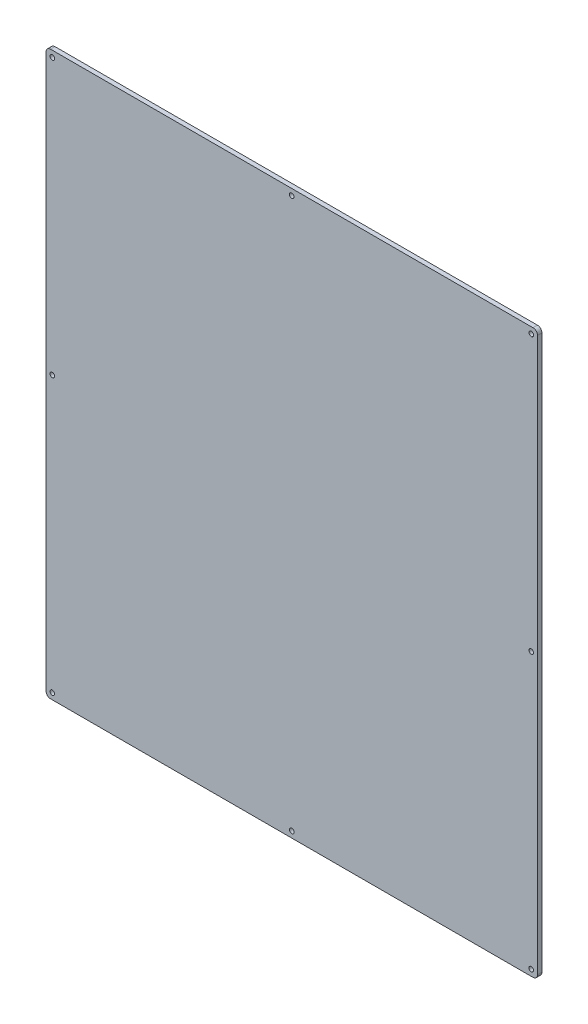
ISO-10303-21;
HEADER;
FILE_DESCRIPTION(('STEP AP214'),'2;1');
FILE_NAME('part.step','',(''),(''),'','','');
FILE_SCHEMA(('AUTOMOTIVE_DESIGN { 1 0 10303 214 1 1 1 1 }'));
ENDSEC;
DATA;
#1=APPLICATION_CONTEXT('core data for automotive mechanical design processes');
#2=APPLICATION_PROTOCOL_DEFINITION('international standard','automotive_design',2000,#1);
#3=PRODUCT_CONTEXT('',#1,'mechanical');
#4=PRODUCT('Part','Part','',(#3));
#5=PRODUCT_RELATED_PRODUCT_CATEGORY('part','',(#4));
#6=PRODUCT_DEFINITION_FORMATION('','',#4);
#7=PRODUCT_DEFINITION_CONTEXT('part definition',#1,'design');
#8=PRODUCT_DEFINITION('design','',#6,#7);
#9=PRODUCT_DEFINITION_SHAPE('','',#8);
#10=(LENGTH_UNIT() NAMED_UNIT(*) SI_UNIT(.MILLI.,.METRE.));
#11=(NAMED_UNIT(*) PLANE_ANGLE_UNIT() SI_UNIT($,.RADIAN.));
#12=(NAMED_UNIT(*) SI_UNIT($,.STERADIAN.) SOLID_ANGLE_UNIT());
#13=UNCERTAINTY_MEASURE_WITH_UNIT(LENGTH_MEASURE(1.E-05),#10,'distance_accuracy_value','');
#14=(GEOMETRIC_REPRESENTATION_CONTEXT(3) GLOBAL_UNCERTAINTY_ASSIGNED_CONTEXT((#13)) GLOBAL_UNIT_ASSIGNED_CONTEXT((#10,
#11,#12)) REPRESENTATION_CONTEXT('',''));
#15=CARTESIAN_POINT('',(0.,0.,0.));
#16=DIRECTION('',(0.,0.,1.));
#17=DIRECTION('',(1.,0.,0.));
#18=AXIS2_PLACEMENT_3D('',#15,#16,#17);
#19=CARTESIAN_POINT('',(0.,0.,-2.5));
#20=DIRECTION('',(0.,0.,1.));
#21=DIRECTION('',(1.,0.,0.));
#22=AXIS2_PLACEMENT_3D('',#19,#20,#21);
#23=PLANE('',#22);
#24=CARTESIAN_POINT('',(-269.,0.,-2.5));
#25=DIRECTION('',(0.,0.,1.));
#26=DIRECTION('',(1.,0.,0.));
#27=AXIS2_PLACEMENT_3D('',#24,#25,#26);
#28=CIRCLE('',#27,2.59999999999999);
#29=CARTESIAN_POINT('',(-266.4,0.,-2.5));
#30=VERTEX_POINT('',#29);
#31=EDGE_CURVE('E189',#30,#30,#28,.T.);
#32=ORIENTED_EDGE('',*,*,#31,.T.);
#33=EDGE_LOOP('',(#32));
#34=FACE_BOUND('',#33,.T.);
#35=CARTESIAN_POINT('',(-269.,-309.,-2.5));
#36=DIRECTION('',(0.,0.,1.));
#37=DIRECTION('',(1.,0.,0.));
#38=AXIS2_PLACEMENT_3D('',#35,#36,#37);
#39=CIRCLE('',#38,2.59999999999999);
#40=CARTESIAN_POINT('',(-266.4,-309.,-2.5));
#41=VERTEX_POINT('',#40);
#42=EDGE_CURVE('E192',#41,#41,#39,.T.);
#43=ORIENTED_EDGE('',*,*,#42,.T.);
#44=EDGE_LOOP('',(#43));
#45=FACE_BOUND('',#44,.T.);
#46=CARTESIAN_POINT('',(0.,-309.,-2.5));
#47=DIRECTION('',(0.,0.,1.));
#48=DIRECTION('',(1.,0.,0.));
#49=AXIS2_PLACEMENT_3D('',#46,#47,#48);
#50=CIRCLE('',#49,2.59999999999999);
#51=CARTESIAN_POINT('',(2.6,-309.,-2.5));
#52=VERTEX_POINT('',#51);
#53=EDGE_CURVE('E195',#52,#52,#50,.T.);
#54=ORIENTED_EDGE('',*,*,#53,.T.);
#55=EDGE_LOOP('',(#54));
#56=FACE_BOUND('',#55,.T.);
#57=CARTESIAN_POINT('',(269.,-309.,-2.5));
#58=DIRECTION('',(0.,0.,1.));
#59=DIRECTION('',(1.,0.,0.));
#60=AXIS2_PLACEMENT_3D('',#57,#58,#59);
#61=CIRCLE('',#60,2.59999999999999);
#62=CARTESIAN_POINT('',(271.6,-309.,-2.5));
#63=VERTEX_POINT('',#62);
#64=EDGE_CURVE('E198',#63,#63,#61,.T.);
#65=ORIENTED_EDGE('',*,*,#64,.T.);
#66=EDGE_LOOP('',(#65));
#67=FACE_BOUND('',#66,.T.);
#68=CARTESIAN_POINT('',(269.,0.,-2.5));
#69=DIRECTION('',(0.,0.,1.));
#70=DIRECTION('',(1.,0.,0.));
#71=AXIS2_PLACEMENT_3D('',#68,#69,#70);
#72=CIRCLE('',#71,2.59999999999999);
#73=CARTESIAN_POINT('',(271.6,0.,-2.5));
#74=VERTEX_POINT('',#73);
#75=EDGE_CURVE('E201',#74,#74,#72,.T.);
#76=ORIENTED_EDGE('',*,*,#75,.T.);
#77=EDGE_LOOP('',(#76));
#78=FACE_BOUND('',#77,.T.);
#79=CARTESIAN_POINT('',(269.,309.,-2.5));
#80=DIRECTION('',(0.,0.,1.));
#81=DIRECTION('',(1.,0.,0.));
#82=AXIS2_PLACEMENT_3D('',#79,#80,#81);
#83=CIRCLE('',#82,2.59999999999999);
#84=CARTESIAN_POINT('',(271.6,309.,-2.5));
#85=VERTEX_POINT('',#84);
#86=EDGE_CURVE('E204',#85,#85,#83,.T.);
#87=ORIENTED_EDGE('',*,*,#86,.T.);
#88=EDGE_LOOP('',(#87));
#89=FACE_BOUND('',#88,.T.);
#90=CARTESIAN_POINT('',(0.,309.,-2.5));
#91=DIRECTION('',(0.,0.,1.));
#92=DIRECTION('',(1.,0.,0.));
#93=AXIS2_PLACEMENT_3D('',#90,#91,#92);
#94=CIRCLE('',#93,2.59999999999999);
#95=CARTESIAN_POINT('',(2.6,309.,-2.5));
#96=VERTEX_POINT('',#95);
#97=EDGE_CURVE('E207',#96,#96,#94,.T.);
#98=ORIENTED_EDGE('',*,*,#97,.T.);
#99=EDGE_LOOP('',(#98));
#100=FACE_BOUND('',#99,.T.);
#101=CARTESIAN_POINT('',(-269.,309.,-2.5));
#102=DIRECTION('',(0.,0.,1.));
#103=DIRECTION('',(1.,0.,0.));
#104=AXIS2_PLACEMENT_3D('',#101,#102,#103);
#105=CIRCLE('',#104,2.59999999999999);
#106=CARTESIAN_POINT('',(-266.4,309.,-2.5));
#107=VERTEX_POINT('',#106);
#108=EDGE_CURVE('E210',#107,#107,#105,.T.);
#109=ORIENTED_EDGE('',*,*,#108,.T.);
#110=EDGE_LOOP('',(#109));
#111=FACE_BOUND('',#110,.T.);
#112=DIRECTION('',(1.,0.,0.));
#113=VECTOR('',#112,1.);
#114=CARTESIAN_POINT('',(-276.,316.,-2.5));
#115=LINE('',#114,#113);
#116=CARTESIAN_POINT('',(-271.,316.,-2.5));
#117=VERTEX_POINT('',#116);
#118=CARTESIAN_POINT('',(271.,316.,-2.5));
#119=VERTEX_POINT('',#118);
#120=EDGE_CURVE('E152',#117,#119,#115,.T.);
#121=ORIENTED_EDGE('',*,*,#120,.T.);
#122=CARTESIAN_POINT('',(271.,311.,-2.5));
#123=DIRECTION('',(0.,0.,-1.));
#124=DIRECTION('',(-1.,0.,0.));
#125=AXIS2_PLACEMENT_3D('',#122,#123,#124);
#126=CIRCLE('',#125,5.);
#127=CARTESIAN_POINT('',(276.,311.,-2.5));
#128=VERTEX_POINT('',#127);
#129=EDGE_CURVE('E124',#128,#119,#126,.F.);
#130=ORIENTED_EDGE('',*,*,#129,.F.);
#131=DIRECTION('',(0.,-1.,0.));
#132=VECTOR('',#131,1.);
#133=CARTESIAN_POINT('',(276.,316.,-2.5));
#134=LINE('',#133,#132);
#135=CARTESIAN_POINT('',(276.,-311.,-2.5));
#136=VERTEX_POINT('',#135);
#137=EDGE_CURVE('E122',#128,#136,#134,.T.);
#138=ORIENTED_EDGE('',*,*,#137,.T.);
#139=CARTESIAN_POINT('',(271.,-311.,-2.5));
#140=DIRECTION('',(0.,0.,-1.));
#141=DIRECTION('',(-1.,0.,0.));
#142=AXIS2_PLACEMENT_3D('',#139,#140,#141);
#143=CIRCLE('',#142,5.);
#144=CARTESIAN_POINT('',(271.,-316.,-2.5));
#145=VERTEX_POINT('',#144);
#146=EDGE_CURVE('E47',#145,#136,#143,.F.);
#147=ORIENTED_EDGE('',*,*,#146,.F.);
#148=DIRECTION('',(1.,0.,0.));
#149=VECTOR('',#148,1.);
#150=CARTESIAN_POINT('',(-276.,-316.,-2.5));
#151=LINE('',#150,#149);
#152=CARTESIAN_POINT('',(-271.,-316.,-2.5));
#153=VERTEX_POINT('',#152);
#154=EDGE_CURVE('E136',#145,#153,#151,.F.);
#155=ORIENTED_EDGE('',*,*,#154,.T.);
#156=CARTESIAN_POINT('',(-271.,-311.,-2.5));
#157=DIRECTION('',(0.,0.,-1.));
#158=DIRECTION('',(-1.,0.,0.));
#159=AXIS2_PLACEMENT_3D('',#156,#157,#158);
#160=CIRCLE('',#159,5.);
#161=CARTESIAN_POINT('',(-276.,-311.,-2.5));
#162=VERTEX_POINT('',#161);
#163=EDGE_CURVE('E213',#162,#153,#160,.F.);
#164=ORIENTED_EDGE('',*,*,#163,.F.);
#165=DIRECTION('',(0.,1.,0.));
#166=VECTOR('',#165,1.);
#167=CARTESIAN_POINT('',(-276.,316.,-2.5));
#168=LINE('',#167,#166);
#169=CARTESIAN_POINT('',(-276.,311.,-2.5));
#170=VERTEX_POINT('',#169);
#171=EDGE_CURVE('E147',#162,#170,#168,.T.);
#172=ORIENTED_EDGE('',*,*,#171,.T.);
#173=CARTESIAN_POINT('',(-271.,311.,-2.5));
#174=DIRECTION('',(0.,0.,-1.));
#175=DIRECTION('',(-1.,0.,0.));
#176=AXIS2_PLACEMENT_3D('',#173,#174,#175);
#177=CIRCLE('',#176,5.);
#178=EDGE_CURVE('E217',#117,#170,#177,.F.);
#179=ORIENTED_EDGE('',*,*,#178,.F.);
#180=EDGE_LOOP('',(#121,#130,#138,#147,#155,#164,#172,#179));
#181=FACE_BOUND('',#180,.T.);
#182=ADVANCED_FACE('F44',(#34,#45,#56,#67,#78,#89,#100,#111,#181),#23,.F.);
#183=CARTESIAN_POINT('',(-276.,-316.,2.5));
#184=DIRECTION('',(0.,1.,0.));
#185=DIRECTION('',(0.,0.,1.));
#186=AXIS2_PLACEMENT_3D('',#183,#184,#185);
#187=PLANE('',#186);
#188=DIRECTION('',(1.,0.,0.));
#189=VECTOR('',#188,1.);
#190=CARTESIAN_POINT('',(0.,-316.,2.5));
#191=LINE('',#190,#189);
#192=CARTESIAN_POINT('',(-271.,-316.,2.5));
#193=VERTEX_POINT('',#192);
#194=CARTESIAN_POINT('',(271.,-316.,2.5));
#195=VERTEX_POINT('',#194);
#196=EDGE_CURVE('E188',#193,#195,#191,.T.);
#197=ORIENTED_EDGE('',*,*,#196,.F.);
#198=DIRECTION('',(0.,0.,-1.));
#199=VECTOR('',#198,1.);
#200=CARTESIAN_POINT('',(-271.,-316.,2.5));
#201=LINE('',#200,#199);
#202=EDGE_CURVE('E216',#153,#193,#201,.F.);
#203=ORIENTED_EDGE('',*,*,#202,.F.);
#204=ORIENTED_EDGE('',*,*,#154,.F.);
#205=DIRECTION('',(0.,0.,-1.));
#206=VECTOR('',#205,1.);
#207=CARTESIAN_POINT('',(271.,-316.,2.5));
#208=LINE('',#207,#206);
#209=EDGE_CURVE('E129',#195,#145,#208,.T.);
#210=ORIENTED_EDGE('',*,*,#209,.F.);
#211=EDGE_LOOP('',(#197,#203,#204,#210));
#212=FACE_BOUND('',#211,.T.);
#213=ADVANCED_FACE('F249',(#212),#187,.F.);
#214=CARTESIAN_POINT('',(271.,-311.,2.5));
#215=DIRECTION('',(0.,0.,-1.));
#216=DIRECTION('',(-1.,0.,0.));
#217=AXIS2_PLACEMENT_3D('',#214,#215,#216);
#218=CYLINDRICAL_SURFACE('',#217,5.);
#219=CARTESIAN_POINT('',(271.,-311.,2.5));
#220=DIRECTION('',(0.,0.,-1.));
#221=DIRECTION('',(-1.,0.,0.));
#222=AXIS2_PLACEMENT_3D('',#219,#220,#221);
#223=CIRCLE('',#222,5.);
#224=CARTESIAN_POINT('',(276.,-311.,2.5));
#225=VERTEX_POINT('',#224);
#226=EDGE_CURVE('E186',#195,#225,#223,.F.);
#227=ORIENTED_EDGE('',*,*,#226,.F.);
#228=ORIENTED_EDGE('',*,*,#209,.T.);
#229=ORIENTED_EDGE('',*,*,#146,.T.);
#230=DIRECTION('',(0.,0.,1.));
#231=VECTOR('',#230,1.);
#232=CARTESIAN_POINT('',(276.,-311.,2.5));
#233=LINE('',#232,#231);
#234=EDGE_CURVE('E128',#136,#225,#233,.T.);
#235=ORIENTED_EDGE('',*,*,#234,.T.);
#236=EDGE_LOOP('',(#227,#228,#229,#235));
#237=FACE_BOUND('',#236,.T.);
#238=ADVANCED_FACE('F134',(#237),#218,.T.);
#239=CARTESIAN_POINT('',(276.,316.,2.5));
#240=DIRECTION('',(-1.,0.,0.));
#241=DIRECTION('',(0.,-1.,0.));
#242=AXIS2_PLACEMENT_3D('',#239,#240,#241);
#243=PLANE('',#242);
#244=DIRECTION('',(0.,1.,0.));
#245=VECTOR('',#244,1.);
#246=CARTESIAN_POINT('',(276.,0.,2.5));
#247=LINE('',#246,#245);
#248=CARTESIAN_POINT('',(276.,311.,2.5));
#249=VERTEX_POINT('',#248);
#250=EDGE_CURVE('E139',#225,#249,#247,.T.);
#251=ORIENTED_EDGE('',*,*,#250,.F.);
#252=ORIENTED_EDGE('',*,*,#234,.F.);
#253=ORIENTED_EDGE('',*,*,#137,.F.);
#254=DIRECTION('',(0.,0.,-1.));
#255=VECTOR('',#254,1.);
#256=CARTESIAN_POINT('',(276.,311.,2.5));
#257=LINE('',#256,#255);
#258=EDGE_CURVE('E142',#249,#128,#257,.T.);
#259=ORIENTED_EDGE('',*,*,#258,.F.);
#260=EDGE_LOOP('',(#251,#252,#253,#259));
#261=FACE_BOUND('',#260,.T.);
#262=ADVANCED_FACE('F137',(#261),#243,.F.);
#263=CARTESIAN_POINT('',(271.,311.,2.5));
#264=DIRECTION('',(0.,0.,-1.));
#265=DIRECTION('',(-1.,0.,0.));
#266=AXIS2_PLACEMENT_3D('',#263,#264,#265);
#267=CYLINDRICAL_SURFACE('',#266,5.);
#268=CARTESIAN_POINT('',(271.,311.,2.5));
#269=DIRECTION('',(0.,0.,-1.));
#270=DIRECTION('',(-1.,0.,0.));
#271=AXIS2_PLACEMENT_3D('',#268,#269,#270);
#272=CIRCLE('',#271,5.);
#273=CARTESIAN_POINT('',(271.,316.,2.5));
#274=VERTEX_POINT('',#273);
#275=EDGE_CURVE('E183',#249,#274,#272,.F.);
#276=ORIENTED_EDGE('',*,*,#275,.F.);
#277=ORIENTED_EDGE('',*,*,#258,.T.);
#278=ORIENTED_EDGE('',*,*,#129,.T.);
#279=DIRECTION('',(0.,0.,-1.));
#280=VECTOR('',#279,1.);
#281=CARTESIAN_POINT('',(271.,316.,2.5));
#282=LINE('',#281,#280);
#283=EDGE_CURVE('E153',#119,#274,#282,.F.);
#284=ORIENTED_EDGE('',*,*,#283,.T.);
#285=EDGE_LOOP('',(#276,#277,#278,#284));
#286=FACE_BOUND('',#285,.T.);
#287=ADVANCED_FACE('F246',(#286),#267,.T.);
#288=CARTESIAN_POINT('',(-276.,316.,2.5));
#289=DIRECTION('',(0.,-1.,0.));
#290=DIRECTION('',(0.,0.,-1.));
#291=AXIS2_PLACEMENT_3D('',#288,#289,#290);
#292=PLANE('',#291);
#293=DIRECTION('',(1.,0.,0.));
#294=VECTOR('',#293,1.);
#295=CARTESIAN_POINT('',(0.,316.,2.5));
#296=LINE('',#295,#294);
#297=CARTESIAN_POINT('',(-271.,316.,2.5));
#298=VERTEX_POINT('',#297);
#299=EDGE_CURVE('E182',#274,#298,#296,.F.);
#300=ORIENTED_EDGE('',*,*,#299,.F.);
#301=ORIENTED_EDGE('',*,*,#283,.F.);
#302=ORIENTED_EDGE('',*,*,#120,.F.);
#303=DIRECTION('',(0.,0.,-1.));
#304=VECTOR('',#303,1.);
#305=CARTESIAN_POINT('',(-271.,316.,2.5));
#306=LINE('',#305,#304);
#307=EDGE_CURVE('E150',#298,#117,#306,.T.);
#308=ORIENTED_EDGE('',*,*,#307,.F.);
#309=EDGE_LOOP('',(#300,#301,#302,#308));
#310=FACE_BOUND('',#309,.T.);
#311=ADVANCED_FACE('F244',(#310),#292,.F.);
#312=CARTESIAN_POINT('',(-271.,311.,2.5));
#313=DIRECTION('',(0.,0.,-1.));
#314=DIRECTION('',(-1.,0.,0.));
#315=AXIS2_PLACEMENT_3D('',#312,#313,#314);
#316=CYLINDRICAL_SURFACE('',#315,5.);
#317=CARTESIAN_POINT('',(-271.,311.,2.5));
#318=DIRECTION('',(0.,0.,-1.));
#319=DIRECTION('',(-1.,0.,0.));
#320=AXIS2_PLACEMENT_3D('',#317,#318,#319);
#321=CIRCLE('',#320,5.);
#322=CARTESIAN_POINT('',(-276.,311.,2.5));
#323=VERTEX_POINT('',#322);
#324=EDGE_CURVE('E179',#298,#323,#321,.F.);
#325=ORIENTED_EDGE('',*,*,#324,.F.);
#326=ORIENTED_EDGE('',*,*,#307,.T.);
#327=ORIENTED_EDGE('',*,*,#178,.T.);
#328=DIRECTION('',(0.,0.,1.));
#329=VECTOR('',#328,1.);
#330=CARTESIAN_POINT('',(-276.,311.,2.5));
#331=LINE('',#330,#329);
#332=EDGE_CURVE('E149',#170,#323,#331,.T.);
#333=ORIENTED_EDGE('',*,*,#332,.T.);
#334=EDGE_LOOP('',(#325,#326,#327,#333));
#335=FACE_BOUND('',#334,.T.);
#336=ADVANCED_FACE('F242',(#335),#316,.T.);
#337=CARTESIAN_POINT('',(-276.,316.,2.5));
#338=DIRECTION('',(1.,0.,0.));
#339=DIRECTION('',(0.,1.,0.));
#340=AXIS2_PLACEMENT_3D('',#337,#338,#339);
#341=PLANE('',#340);
#342=ORIENTED_EDGE('',*,*,#171,.F.);
#343=DIRECTION('',(0.,0.,-1.));
#344=VECTOR('',#343,1.);
#345=CARTESIAN_POINT('',(-276.,-311.,2.5));
#346=LINE('',#345,#344);
#347=CARTESIAN_POINT('',(-276.,-311.,2.5));
#348=VERTEX_POINT('',#347);
#349=EDGE_CURVE('E65',#348,#162,#346,.T.);
#350=ORIENTED_EDGE('',*,*,#349,.F.);
#351=DIRECTION('',(0.,1.,0.));
#352=VECTOR('',#351,1.);
#353=CARTESIAN_POINT('',(-276.,0.,2.5));
#354=LINE('',#353,#352);
#355=EDGE_CURVE('E178',#323,#348,#354,.F.);
#356=ORIENTED_EDGE('',*,*,#355,.F.);
#357=ORIENTED_EDGE('',*,*,#332,.F.);
#358=EDGE_LOOP('',(#342,#350,#356,#357));
#359=FACE_BOUND('',#358,.T.);
#360=ADVANCED_FACE('F241',(#359),#341,.F.);
#361=CARTESIAN_POINT('',(-271.,-311.,2.5));
#362=DIRECTION('',(0.,0.,-1.));
#363=DIRECTION('',(-1.,0.,0.));
#364=AXIS2_PLACEMENT_3D('',#361,#362,#363);
#365=CYLINDRICAL_SURFACE('',#364,5.);
#366=CARTESIAN_POINT('',(-271.,-311.,2.5));
#367=DIRECTION('',(0.,0.,-1.));
#368=DIRECTION('',(-1.,0.,0.));
#369=AXIS2_PLACEMENT_3D('',#366,#367,#368);
#370=CIRCLE('',#369,5.);
#371=EDGE_CURVE('E175',#348,#193,#370,.F.);
#372=ORIENTED_EDGE('',*,*,#371,.F.);
#373=ORIENTED_EDGE('',*,*,#349,.T.);
#374=ORIENTED_EDGE('',*,*,#163,.T.);
#375=ORIENTED_EDGE('',*,*,#202,.T.);
#376=EDGE_LOOP('',(#372,#373,#374,#375));
#377=FACE_BOUND('',#376,.T.);
#378=ADVANCED_FACE('F251',(#377),#365,.T.);
#379=CARTESIAN_POINT('',(-269.,309.,-2.5));
#380=DIRECTION('',(0.,0.,1.));
#381=DIRECTION('',(1.,0.,0.));
#382=AXIS2_PLACEMENT_3D('',#379,#380,#381);
#383=CYLINDRICAL_SURFACE('',#382,2.59999999999999);
#384=ORIENTED_EDGE('',*,*,#108,.F.);
#385=EDGE_LOOP('',(#384));
#386=FACE_BOUND('',#385,.T.);
#387=CARTESIAN_POINT('',(-269.,309.,2.5));
#388=DIRECTION('',(0.,0.,1.));
#389=DIRECTION('',(1.,0.,0.));
#390=AXIS2_PLACEMENT_3D('',#387,#388,#389);
#391=CIRCLE('',#390,2.59999999999999);
#392=CARTESIAN_POINT('',(-266.4,309.,2.5));
#393=VERTEX_POINT('',#392);
#394=EDGE_CURVE('E172',#393,#393,#391,.F.);
#395=ORIENTED_EDGE('',*,*,#394,.F.);
#396=EDGE_LOOP('',(#395));
#397=FACE_BOUND('',#396,.T.);
#398=ADVANCED_FACE('F253',(#386,#397),#383,.F.);
#399=CARTESIAN_POINT('',(0.,309.,-2.5));
#400=DIRECTION('',(0.,0.,1.));
#401=DIRECTION('',(1.,0.,0.));
#402=AXIS2_PLACEMENT_3D('',#399,#400,#401);
#403=CYLINDRICAL_SURFACE('',#402,2.59999999999999);
#404=ORIENTED_EDGE('',*,*,#97,.F.);
#405=EDGE_LOOP('',(#404));
#406=FACE_BOUND('',#405,.T.);
#407=CARTESIAN_POINT('',(0.,309.,2.5));
#408=DIRECTION('',(0.,0.,1.));
#409=DIRECTION('',(1.,0.,0.));
#410=AXIS2_PLACEMENT_3D('',#407,#408,#409);
#411=CIRCLE('',#410,2.59999999999999);
#412=CARTESIAN_POINT('',(2.6,309.,2.5));
#413=VERTEX_POINT('',#412);
#414=EDGE_CURVE('E169',#413,#413,#411,.F.);
#415=ORIENTED_EDGE('',*,*,#414,.F.);
#416=EDGE_LOOP('',(#415));
#417=FACE_BOUND('',#416,.T.);
#418=ADVANCED_FACE('F259',(#406,#417),#403,.F.);
#419=CARTESIAN_POINT('',(269.,309.,-2.5));
#420=DIRECTION('',(0.,0.,1.));
#421=DIRECTION('',(1.,0.,0.));
#422=AXIS2_PLACEMENT_3D('',#419,#420,#421);
#423=CYLINDRICAL_SURFACE('',#422,2.59999999999999);
#424=ORIENTED_EDGE('',*,*,#86,.F.);
#425=EDGE_LOOP('',(#424));
#426=FACE_BOUND('',#425,.T.);
#427=CARTESIAN_POINT('',(269.,309.,2.5));
#428=DIRECTION('',(0.,0.,1.));
#429=DIRECTION('',(1.,0.,0.));
#430=AXIS2_PLACEMENT_3D('',#427,#428,#429);
#431=CIRCLE('',#430,2.59999999999999);
#432=CARTESIAN_POINT('',(271.6,309.,2.5));
#433=VERTEX_POINT('',#432);
#434=EDGE_CURVE('E166',#433,#433,#431,.F.);
#435=ORIENTED_EDGE('',*,*,#434,.F.);
#436=EDGE_LOOP('',(#435));
#437=FACE_BOUND('',#436,.T.);
#438=ADVANCED_FACE('F289',(#426,#437),#423,.F.);
#439=CARTESIAN_POINT('',(269.,0.,-2.5));
#440=DIRECTION('',(0.,0.,1.));
#441=DIRECTION('',(1.,0.,0.));
#442=AXIS2_PLACEMENT_3D('',#439,#440,#441);
#443=CYLINDRICAL_SURFACE('',#442,2.59999999999999);
#444=ORIENTED_EDGE('',*,*,#75,.F.);
#445=EDGE_LOOP('',(#444));
#446=FACE_BOUND('',#445,.T.);
#447=CARTESIAN_POINT('',(269.,0.,2.5));
#448=DIRECTION('',(0.,0.,1.));
#449=DIRECTION('',(1.,0.,0.));
#450=AXIS2_PLACEMENT_3D('',#447,#448,#449);
#451=CIRCLE('',#450,2.59999999999999);
#452=CARTESIAN_POINT('',(271.6,0.,2.5));
#453=VERTEX_POINT('',#452);
#454=EDGE_CURVE('E163',#453,#453,#451,.F.);
#455=ORIENTED_EDGE('',*,*,#454,.F.);
#456=EDGE_LOOP('',(#455));
#457=FACE_BOUND('',#456,.T.);
#458=ADVANCED_FACE('F285',(#446,#457),#443,.F.);
#459=CARTESIAN_POINT('',(269.,-309.,-2.5));
#460=DIRECTION('',(0.,0.,1.));
#461=DIRECTION('',(1.,0.,0.));
#462=AXIS2_PLACEMENT_3D('',#459,#460,#461);
#463=CYLINDRICAL_SURFACE('',#462,2.59999999999999);
#464=ORIENTED_EDGE('',*,*,#64,.F.);
#465=EDGE_LOOP('',(#464));
#466=FACE_BOUND('',#465,.T.);
#467=CARTESIAN_POINT('',(269.,-309.,2.5));
#468=DIRECTION('',(0.,0.,1.));
#469=DIRECTION('',(1.,0.,0.));
#470=AXIS2_PLACEMENT_3D('',#467,#468,#469);
#471=CIRCLE('',#470,2.59999999999999);
#472=CARTESIAN_POINT('',(271.6,-309.,2.5));
#473=VERTEX_POINT('',#472);
#474=EDGE_CURVE('E160',#473,#473,#471,.F.);
#475=ORIENTED_EDGE('',*,*,#474,.F.);
#476=EDGE_LOOP('',(#475));
#477=FACE_BOUND('',#476,.T.);
#478=ADVANCED_FACE('F281',(#466,#477),#463,.F.);
#479=CARTESIAN_POINT('',(0.,-309.,-2.5));
#480=DIRECTION('',(0.,0.,1.));
#481=DIRECTION('',(1.,0.,0.));
#482=AXIS2_PLACEMENT_3D('',#479,#480,#481);
#483=CYLINDRICAL_SURFACE('',#482,2.59999999999999);
#484=ORIENTED_EDGE('',*,*,#53,.F.);
#485=EDGE_LOOP('',(#484));
#486=FACE_BOUND('',#485,.T.);
#487=CARTESIAN_POINT('',(0.,-309.,2.5));
#488=DIRECTION('',(0.,0.,1.));
#489=DIRECTION('',(1.,0.,0.));
#490=AXIS2_PLACEMENT_3D('',#487,#488,#489);
#491=CIRCLE('',#490,2.59999999999999);
#492=CARTESIAN_POINT('',(2.6,-309.,2.5));
#493=VERTEX_POINT('',#492);
#494=EDGE_CURVE('E157',#493,#493,#491,.F.);
#495=ORIENTED_EDGE('',*,*,#494,.F.);
#496=EDGE_LOOP('',(#495));
#497=FACE_BOUND('',#496,.T.);
#498=ADVANCED_FACE('F277',(#486,#497),#483,.F.);
#499=CARTESIAN_POINT('',(-269.,-309.,-2.5));
#500=DIRECTION('',(0.,0.,1.));
#501=DIRECTION('',(1.,0.,0.));
#502=AXIS2_PLACEMENT_3D('',#499,#500,#501);
#503=CYLINDRICAL_SURFACE('',#502,2.59999999999999);
#504=ORIENTED_EDGE('',*,*,#42,.F.);
#505=EDGE_LOOP('',(#504));
#506=FACE_BOUND('',#505,.T.);
#507=CARTESIAN_POINT('',(-269.,-309.,2.5));
#508=DIRECTION('',(0.,0.,1.));
#509=DIRECTION('',(1.,0.,0.));
#510=AXIS2_PLACEMENT_3D('',#507,#508,#509);
#511=CIRCLE('',#510,2.59999999999999);
#512=CARTESIAN_POINT('',(-266.4,-309.,2.5));
#513=VERTEX_POINT('',#512);
#514=EDGE_CURVE('E53',#513,#513,#511,.F.);
#515=ORIENTED_EDGE('',*,*,#514,.F.);
#516=EDGE_LOOP('',(#515));
#517=FACE_BOUND('',#516,.T.);
#518=ADVANCED_FACE('F270',(#506,#517),#503,.F.);
#519=CARTESIAN_POINT('',(-269.,0.,-2.5));
#520=DIRECTION('',(0.,0.,1.));
#521=DIRECTION('',(1.,0.,0.));
#522=AXIS2_PLACEMENT_3D('',#519,#520,#521);
#523=CYLINDRICAL_SURFACE('',#522,2.59999999999999);
#524=ORIENTED_EDGE('',*,*,#31,.F.);
#525=EDGE_LOOP('',(#524));
#526=FACE_BOUND('',#525,.T.);
#527=CARTESIAN_POINT('',(-269.,0.,2.5));
#528=DIRECTION('',(0.,0.,1.));
#529=DIRECTION('',(1.,0.,0.));
#530=AXIS2_PLACEMENT_3D('',#527,#528,#529);
#531=CIRCLE('',#530,2.59999999999999);
#532=CARTESIAN_POINT('',(-266.4,0.,2.5));
#533=VERTEX_POINT('',#532);
#534=EDGE_CURVE('E11',#533,#533,#531,.F.);
#535=ORIENTED_EDGE('',*,*,#534,.F.);
#536=EDGE_LOOP('',(#535));
#537=FACE_BOUND('',#536,.T.);
#538=ADVANCED_FACE('F264',(#526,#537),#523,.F.);
#539=CARTESIAN_POINT('',(0.,0.,2.5));
#540=DIRECTION('',(0.,0.,1.));
#541=DIRECTION('',(1.,0.,0.));
#542=AXIS2_PLACEMENT_3D('',#539,#540,#541);
#543=PLANE('',#542);
#544=ORIENTED_EDGE('',*,*,#534,.T.);
#545=EDGE_LOOP('',(#544));
#546=FACE_BOUND('',#545,.T.);
#547=ORIENTED_EDGE('',*,*,#514,.T.);
#548=EDGE_LOOP('',(#547));
#549=FACE_BOUND('',#548,.T.);
#550=ORIENTED_EDGE('',*,*,#494,.T.);
#551=EDGE_LOOP('',(#550));
#552=FACE_BOUND('',#551,.T.);
#553=ORIENTED_EDGE('',*,*,#474,.T.);
#554=EDGE_LOOP('',(#553));
#555=FACE_BOUND('',#554,.T.);
#556=ORIENTED_EDGE('',*,*,#454,.T.);
#557=EDGE_LOOP('',(#556));
#558=FACE_BOUND('',#557,.T.);
#559=ORIENTED_EDGE('',*,*,#434,.T.);
#560=EDGE_LOOP('',(#559));
#561=FACE_BOUND('',#560,.T.);
#562=ORIENTED_EDGE('',*,*,#414,.T.);
#563=EDGE_LOOP('',(#562));
#564=FACE_BOUND('',#563,.T.);
#565=ORIENTED_EDGE('',*,*,#394,.T.);
#566=EDGE_LOOP('',(#565));
#567=FACE_BOUND('',#566,.T.);
#568=ORIENTED_EDGE('',*,*,#355,.T.);
#569=ORIENTED_EDGE('',*,*,#371,.T.);
#570=ORIENTED_EDGE('',*,*,#196,.T.);
#571=ORIENTED_EDGE('',*,*,#226,.T.);
#572=ORIENTED_EDGE('',*,*,#250,.T.);
#573=ORIENTED_EDGE('',*,*,#275,.T.);
#574=ORIENTED_EDGE('',*,*,#299,.T.);
#575=ORIENTED_EDGE('',*,*,#324,.T.);
#576=EDGE_LOOP('',(#568,#569,#570,#571,#572,#573,#574,#575));
#577=FACE_BOUND('',#576,.T.);
#578=ADVANCED_FACE('F239',(#546,#549,#552,#555,#558,#561,#564,#567,#577),#543,.T.);
#579=CLOSED_SHELL('',(#182,#213,#238,#262,#287,#311,#336,#360,#378,#398,#418,#438,#458,#478,
#498,#518,#538,#578));
#580=MANIFOLD_SOLID_BREP('B2',#579);
#581=ADVANCED_BREP_SHAPE_REPRESENTATION('',(#18,#580),#14);
#582=SHAPE_DEFINITION_REPRESENTATION(#9,#581);
ENDSEC;
END-ISO-10303-21;
